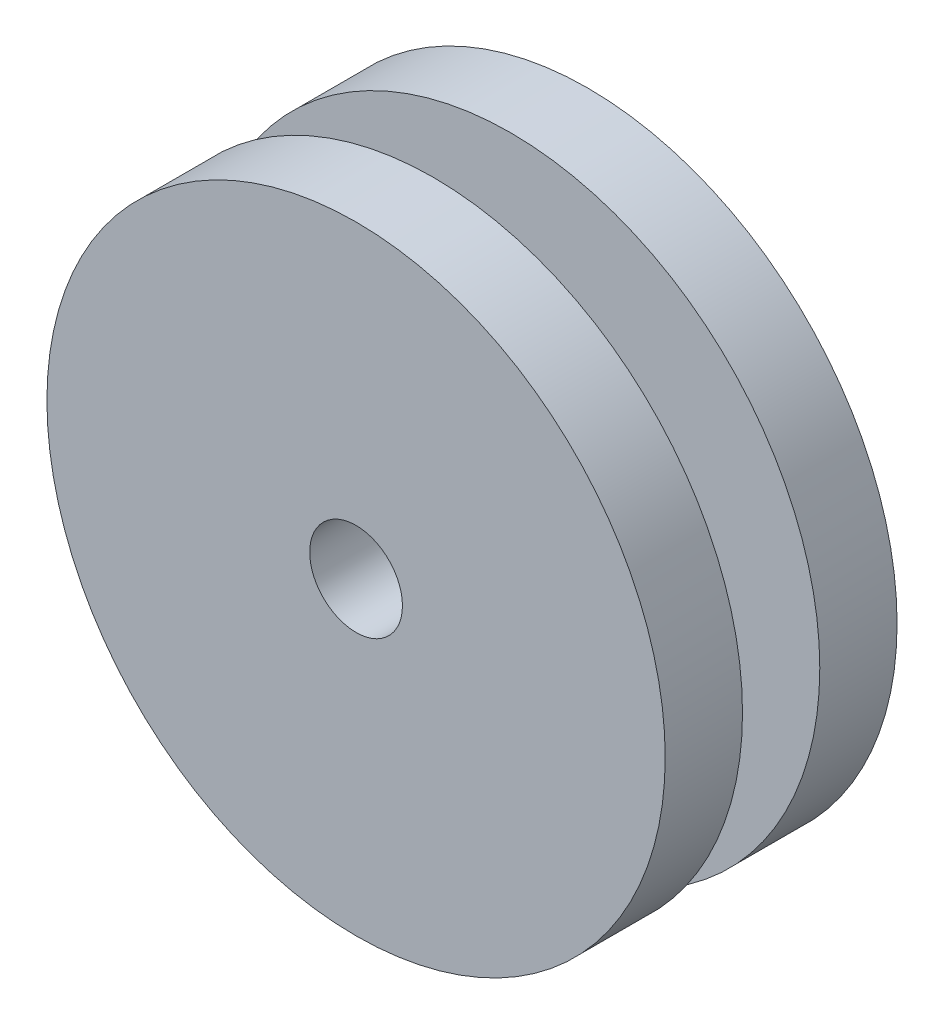
ISO-10303-21;
HEADER;
FILE_DESCRIPTION(('STEP AP214'),'2;1');
FILE_NAME('part.step','',(''),(''),'','','');
FILE_SCHEMA(('AUTOMOTIVE_DESIGN { 1 0 10303 214 1 1 1 1 }'));
ENDSEC;
DATA;
#1=APPLICATION_CONTEXT('core data for automotive mechanical design processes');
#2=APPLICATION_PROTOCOL_DEFINITION('international standard','automotive_design',2000,#1);
#3=PRODUCT_CONTEXT('',#1,'mechanical');
#4=PRODUCT('Part','Part','',(#3));
#5=PRODUCT_RELATED_PRODUCT_CATEGORY('part','',(#4));
#6=PRODUCT_DEFINITION_FORMATION('','',#4);
#7=PRODUCT_DEFINITION_CONTEXT('part definition',#1,'design');
#8=PRODUCT_DEFINITION('design','',#6,#7);
#9=PRODUCT_DEFINITION_SHAPE('','',#8);
#10=(LENGTH_UNIT() NAMED_UNIT(*) SI_UNIT(.MILLI.,.METRE.));
#11=(NAMED_UNIT(*) PLANE_ANGLE_UNIT() SI_UNIT($,.RADIAN.));
#12=(NAMED_UNIT(*) SI_UNIT($,.STERADIAN.) SOLID_ANGLE_UNIT());
#13=UNCERTAINTY_MEASURE_WITH_UNIT(LENGTH_MEASURE(1.E-05),#10,'distance_accuracy_value','');
#14=(GEOMETRIC_REPRESENTATION_CONTEXT(3) GLOBAL_UNCERTAINTY_ASSIGNED_CONTEXT((#13)) GLOBAL_UNIT_ASSIGNED_CONTEXT((#10,
#11,#12)) REPRESENTATION_CONTEXT('',''));
#15=CARTESIAN_POINT('',(0.,0.,0.));
#16=DIRECTION('',(0.,0.,1.));
#17=DIRECTION('',(1.,0.,0.));
#18=AXIS2_PLACEMENT_3D('',#15,#16,#17);
#19=CARTESIAN_POINT('',(0.,0.,5.));
#20=DIRECTION('',(0.,0.,-1.));
#21=DIRECTION('',(-1.,0.,0.));
#22=AXIS2_PLACEMENT_3D('',#19,#20,#21);
#23=CYLINDRICAL_SURFACE('',#22,20.);
#24=CARTESIAN_POINT('',(0.,0.,5.));
#25=DIRECTION('',(0.,0.,1.));
#26=DIRECTION('',(1.,0.,0.));
#27=AXIS2_PLACEMENT_3D('',#24,#25,#26);
#28=CIRCLE('',#27,20.);
#29=CARTESIAN_POINT('',(20.,0.,5.));
#30=VERTEX_POINT('',#29);
#31=EDGE_CURVE('E45',#30,#30,#28,.T.);
#32=ORIENTED_EDGE('',*,*,#31,.F.);
#33=EDGE_LOOP('',(#32));
#34=FACE_BOUND('',#33,.T.);
#35=CARTESIAN_POINT('',(0.,0.,0.));
#36=DIRECTION('',(0.,0.,1.));
#37=DIRECTION('',(1.,0.,0.));
#38=AXIS2_PLACEMENT_3D('',#35,#36,#37);
#39=CIRCLE('',#38,20.);
#40=CARTESIAN_POINT('',(20.,0.,0.));
#41=VERTEX_POINT('',#40);
#42=EDGE_CURVE('E40',#41,#41,#39,.T.);
#43=ORIENTED_EDGE('',*,*,#42,.T.);
#44=EDGE_LOOP('',(#43));
#45=FACE_BOUND('',#44,.T.);
#46=ADVANCED_FACE('F37',(#34,#45),#23,.T.);
#47=CARTESIAN_POINT('',(0.,0.,5.));
#48=DIRECTION('',(0.,0.,1.));
#49=DIRECTION('',(1.,0.,0.));
#50=AXIS2_PLACEMENT_3D('',#47,#48,#49);
#51=PLANE('',#50);
#52=CARTESIAN_POINT('',(0.,0.,5.));
#53=DIRECTION('',(0.,0.,1.));
#54=DIRECTION('',(1.,0.,0.));
#55=AXIS2_PLACEMENT_3D('',#52,#53,#54);
#56=CIRCLE('',#55,10.);
#57=CARTESIAN_POINT('',(10.,0.,5.));
#58=VERTEX_POINT('',#57);
#59=EDGE_CURVE('E10',#58,#58,#56,.T.);
#60=ORIENTED_EDGE('',*,*,#59,.F.);
#61=EDGE_LOOP('',(#60));
#62=FACE_BOUND('',#61,.T.);
#63=ORIENTED_EDGE('',*,*,#31,.T.);
#64=EDGE_LOOP('',(#63));
#65=FACE_BOUND('',#64,.T.);
#66=ADVANCED_FACE('F102',(#62,#65),#51,.T.);
#67=CARTESIAN_POINT('',(0.,0.,0.));
#68=DIRECTION('',(0.,0.,1.));
#69=DIRECTION('',(1.,0.,0.));
#70=AXIS2_PLACEMENT_3D('',#67,#68,#69);
#71=PLANE('',#70);
#72=CARTESIAN_POINT('',(0.,0.,0.));
#73=DIRECTION('',(0.,0.,1.));
#74=DIRECTION('',(1.,0.,0.));
#75=AXIS2_PLACEMENT_3D('',#72,#73,#74);
#76=CIRCLE('',#75,3.);
#77=CARTESIAN_POINT('',(3.,0.,0.));
#78=VERTEX_POINT('',#77);
#79=EDGE_CURVE('E61',#78,#78,#76,.T.);
#80=ORIENTED_EDGE('',*,*,#79,.T.);
#81=EDGE_LOOP('',(#80));
#82=FACE_BOUND('',#81,.T.);
#83=ORIENTED_EDGE('',*,*,#42,.F.);
#84=EDGE_LOOP('',(#83));
#85=FACE_BOUND('',#84,.T.);
#86=ADVANCED_FACE('F73',(#82,#85),#71,.F.);
#87=CARTESIAN_POINT('',(0.,0.,10.));
#88=DIRECTION('',(0.,0.,-1.));
#89=DIRECTION('',(-1.,0.,0.));
#90=AXIS2_PLACEMENT_3D('',#87,#88,#89);
#91=CYLINDRICAL_SURFACE('',#90,10.);
#92=CARTESIAN_POINT('',(0.,0.,10.));
#93=DIRECTION('',(0.,0.,1.));
#94=DIRECTION('',(1.,0.,0.));
#95=AXIS2_PLACEMENT_3D('',#92,#93,#94);
#96=CIRCLE('',#95,10.);
#97=CARTESIAN_POINT('',(10.,0.,10.));
#98=VERTEX_POINT('',#97);
#99=EDGE_CURVE('E52',#98,#98,#96,.T.);
#100=ORIENTED_EDGE('',*,*,#99,.F.);
#101=EDGE_LOOP('',(#100));
#102=FACE_BOUND('',#101,.T.);
#103=ORIENTED_EDGE('',*,*,#59,.T.);
#104=EDGE_LOOP('',(#103));
#105=FACE_BOUND('',#104,.T.);
#106=ADVANCED_FACE('F92',(#102,#105),#91,.T.);
#107=CARTESIAN_POINT('',(0.,0.,15.));
#108=DIRECTION('',(0.,0.,-1.));
#109=DIRECTION('',(-1.,0.,0.));
#110=AXIS2_PLACEMENT_3D('',#107,#108,#109);
#111=CYLINDRICAL_SURFACE('',#110,20.);
#112=CARTESIAN_POINT('',(0.,0.,15.));
#113=DIRECTION('',(0.,0.,1.));
#114=DIRECTION('',(1.,0.,0.));
#115=AXIS2_PLACEMENT_3D('',#112,#113,#114);
#116=CIRCLE('',#115,20.);
#117=CARTESIAN_POINT('',(20.,0.,15.));
#118=VERTEX_POINT('',#117);
#119=EDGE_CURVE('E56',#118,#118,#116,.T.);
#120=ORIENTED_EDGE('',*,*,#119,.F.);
#121=EDGE_LOOP('',(#120));
#122=FACE_BOUND('',#121,.T.);
#123=CARTESIAN_POINT('',(0.,0.,10.));
#124=DIRECTION('',(0.,0.,1.));
#125=DIRECTION('',(1.,0.,0.));
#126=AXIS2_PLACEMENT_3D('',#123,#124,#125);
#127=CIRCLE('',#126,20.);
#128=CARTESIAN_POINT('',(20.,0.,10.));
#129=VERTEX_POINT('',#128);
#130=EDGE_CURVE('E57',#129,#129,#127,.T.);
#131=ORIENTED_EDGE('',*,*,#130,.T.);
#132=EDGE_LOOP('',(#131));
#133=FACE_BOUND('',#132,.T.);
#134=ADVANCED_FACE('F86',(#122,#133),#111,.T.);
#135=CARTESIAN_POINT('',(0.,0.,15.));
#136=DIRECTION('',(0.,0.,1.));
#137=DIRECTION('',(1.,0.,0.));
#138=AXIS2_PLACEMENT_3D('',#135,#136,#137);
#139=PLANE('',#138);
#140=CARTESIAN_POINT('',(0.,0.,15.));
#141=DIRECTION('',(0.,0.,1.));
#142=DIRECTION('',(1.,0.,0.));
#143=AXIS2_PLACEMENT_3D('',#140,#141,#142);
#144=CIRCLE('',#143,3.);
#145=CARTESIAN_POINT('',(3.,0.,15.));
#146=VERTEX_POINT('',#145);
#147=EDGE_CURVE('E65',#146,#146,#144,.T.);
#148=ORIENTED_EDGE('',*,*,#147,.F.);
#149=EDGE_LOOP('',(#148));
#150=FACE_BOUND('',#149,.T.);
#151=ORIENTED_EDGE('',*,*,#119,.T.);
#152=EDGE_LOOP('',(#151));
#153=FACE_BOUND('',#152,.T.);
#154=ADVANCED_FACE('F83',(#150,#153),#139,.T.);
#155=CARTESIAN_POINT('',(0.,0.,10.));
#156=DIRECTION('',(0.,0.,1.));
#157=DIRECTION('',(1.,0.,0.));
#158=AXIS2_PLACEMENT_3D('',#155,#156,#157);
#159=PLANE('',#158);
#160=ORIENTED_EDGE('',*,*,#99,.T.);
#161=EDGE_LOOP('',(#160));
#162=FACE_BOUND('',#161,.T.);
#163=ORIENTED_EDGE('',*,*,#130,.F.);
#164=EDGE_LOOP('',(#163));
#165=FACE_BOUND('',#164,.T.);
#166=ADVANCED_FACE('F79',(#162,#165),#159,.F.);
#167=CARTESIAN_POINT('',(0.,0.,0.));
#168=DIRECTION('',(0.,0.,1.));
#169=DIRECTION('',(1.,0.,0.));
#170=AXIS2_PLACEMENT_3D('',#167,#168,#169);
#171=CYLINDRICAL_SURFACE('',#170,3.);
#172=ORIENTED_EDGE('',*,*,#79,.F.);
#173=EDGE_LOOP('',(#172));
#174=FACE_BOUND('',#173,.T.);
#175=ORIENTED_EDGE('',*,*,#147,.T.);
#176=EDGE_LOOP('',(#175));
#177=FACE_BOUND('',#176,.T.);
#178=ADVANCED_FACE('F76',(#174,#177),#171,.F.);
#179=CLOSED_SHELL('',(#46,#66,#86,#106,#134,#154,#166,#178));
#180=MANIFOLD_SOLID_BREP('B2',#179);
#181=ADVANCED_BREP_SHAPE_REPRESENTATION('',(#18,#180),#14);
#182=SHAPE_DEFINITION_REPRESENTATION(#9,#181);
ENDSEC;
END-ISO-10303-21;
